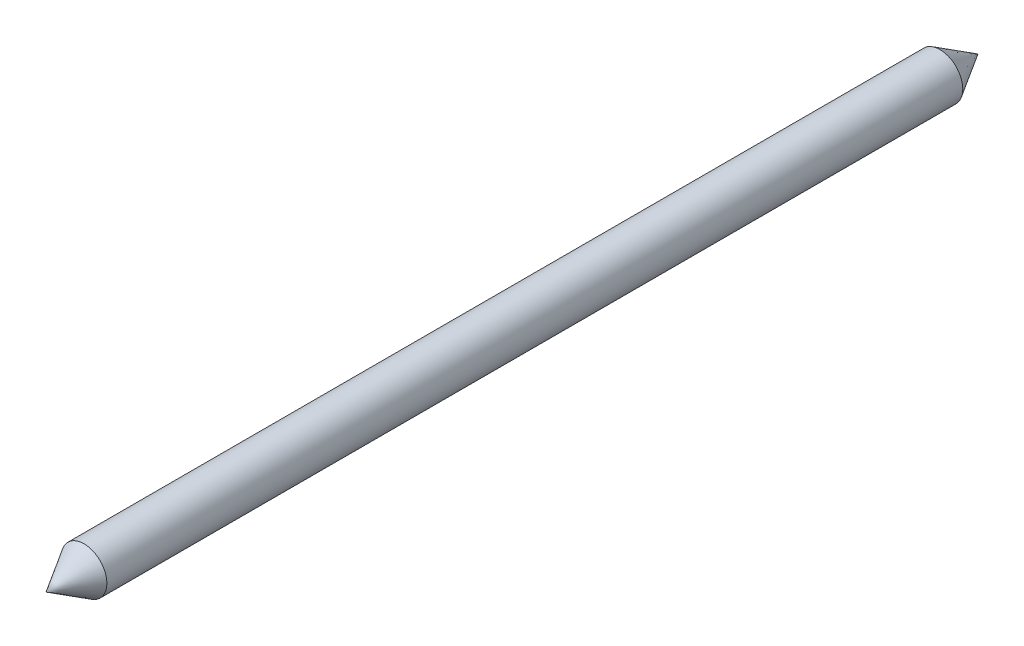
ISO-10303-21;
HEADER;
FILE_DESCRIPTION(('STEP AP214'),'2;1');
FILE_NAME('part.step','',(''),(''),'','','');
FILE_SCHEMA(('AUTOMOTIVE_DESIGN { 1 0 10303 214 1 1 1 1 }'));
ENDSEC;
DATA;
#1=APPLICATION_CONTEXT('core data for automotive mechanical design processes');
#2=APPLICATION_PROTOCOL_DEFINITION('international standard','automotive_design',2000,#1);
#3=PRODUCT_CONTEXT('',#1,'mechanical');
#4=PRODUCT('Part','Part','',(#3));
#5=PRODUCT_RELATED_PRODUCT_CATEGORY('part','',(#4));
#6=PRODUCT_DEFINITION_FORMATION('','',#4);
#7=PRODUCT_DEFINITION_CONTEXT('part definition',#1,'design');
#8=PRODUCT_DEFINITION('design','',#6,#7);
#9=PRODUCT_DEFINITION_SHAPE('','',#8);
#10=(LENGTH_UNIT() NAMED_UNIT(*) SI_UNIT(.MILLI.,.METRE.));
#11=(NAMED_UNIT(*) PLANE_ANGLE_UNIT() SI_UNIT($,.RADIAN.));
#12=(NAMED_UNIT(*) SI_UNIT($,.STERADIAN.) SOLID_ANGLE_UNIT());
#13=UNCERTAINTY_MEASURE_WITH_UNIT(LENGTH_MEASURE(1.E-05),#10,'distance_accuracy_value','');
#14=(GEOMETRIC_REPRESENTATION_CONTEXT(3) GLOBAL_UNCERTAINTY_ASSIGNED_CONTEXT((#13)) GLOBAL_UNIT_ASSIGNED_CONTEXT((#10,
#11,#12)) REPRESENTATION_CONTEXT('',''));
#15=CARTESIAN_POINT('',(0.,0.,0.));
#16=DIRECTION('',(0.,0.,1.));
#17=DIRECTION('',(1.,0.,0.));
#18=AXIS2_PLACEMENT_3D('',#15,#16,#17);
#19=CARTESIAN_POINT('',(0.,0.,-142.875));
#20=DIRECTION('',(0.,0.,1.));
#21=DIRECTION('',(1.,0.,0.));
#22=AXIS2_PLACEMENT_3D('',#19,#20,#21);
#23=CONICAL_SURFACE('',#22,7.62000000000002,0.540419500270585);
#24=CARTESIAN_POINT('',(0.,0.,-155.575));
#25=VERTEX_POINT('',#24);
#26=VERTEX_LOOP('',#25);
#27=FACE_BOUND('',#26,.T.);
#28=CARTESIAN_POINT('',(0.,0.,-142.875));
#29=DIRECTION('',(0.,0.,-1.));
#30=DIRECTION('',(-1.,0.,0.));
#31=AXIS2_PLACEMENT_3D('',#28,#29,#30);
#32=CIRCLE('',#31,7.62000000000002);
#33=CARTESIAN_POINT('',(-7.62000000000002,0.,-142.875));
#34=VERTEX_POINT('',#33);
#35=EDGE_CURVE('E53',#34,#34,#32,.T.);
#36=ORIENTED_EDGE('',*,*,#35,.T.);
#37=EDGE_LOOP('',(#36));
#38=FACE_BOUND('',#37,.T.);
#39=ADVANCED_FACE('F45',(#27,#38),#23,.T.);
#40=CARTESIAN_POINT('',(0.,0.,155.575));
#41=DIRECTION('',(0.,0.,-1.));
#42=DIRECTION('',(-1.,0.,0.));
#43=AXIS2_PLACEMENT_3D('',#40,#41,#42);
#44=CONICAL_SURFACE('',#43,0.,0.540419500270585);
#45=CARTESIAN_POINT('',(0.,0.,142.875));
#46=DIRECTION('',(0.,0.,-1.));
#47=DIRECTION('',(-1.,0.,0.));
#48=AXIS2_PLACEMENT_3D('',#45,#46,#47);
#49=CIRCLE('',#48,7.62000000000002);
#50=CARTESIAN_POINT('',(-7.62000000000002,0.,142.875));
#51=VERTEX_POINT('',#50);
#52=EDGE_CURVE('E11',#51,#51,#49,.T.);
#53=ORIENTED_EDGE('',*,*,#52,.F.);
#54=EDGE_LOOP('',(#53));
#55=FACE_BOUND('',#54,.T.);
#56=CARTESIAN_POINT('',(0.,0.,155.575));
#57=VERTEX_POINT('',#56);
#58=VERTEX_LOOP('',#57);
#59=FACE_BOUND('',#58,.T.);
#60=ADVANCED_FACE('F61',(#55,#59),#44,.T.);
#61=CARTESIAN_POINT('',(0.,0.,-155.575));
#62=DIRECTION('',(0.,0.,-1.));
#63=DIRECTION('',(-1.,0.,0.));
#64=AXIS2_PLACEMENT_3D('',#61,#62,#63);
#65=CYLINDRICAL_SURFACE('',#64,7.62000000000002);
#66=ORIENTED_EDGE('',*,*,#35,.F.);
#67=EDGE_LOOP('',(#66));
#68=FACE_BOUND('',#67,.T.);
#69=ORIENTED_EDGE('',*,*,#52,.T.);
#70=EDGE_LOOP('',(#69));
#71=FACE_BOUND('',#70,.T.);
#72=ADVANCED_FACE('F66',(#68,#71),#65,.T.);
#73=CLOSED_SHELL('',(#39,#60,#72));
#74=MANIFOLD_SOLID_BREP('B2',#73);
#75=ADVANCED_BREP_SHAPE_REPRESENTATION('',(#18,#74),#14);
#76=SHAPE_DEFINITION_REPRESENTATION(#9,#75);
ENDSEC;
END-ISO-10303-21;
